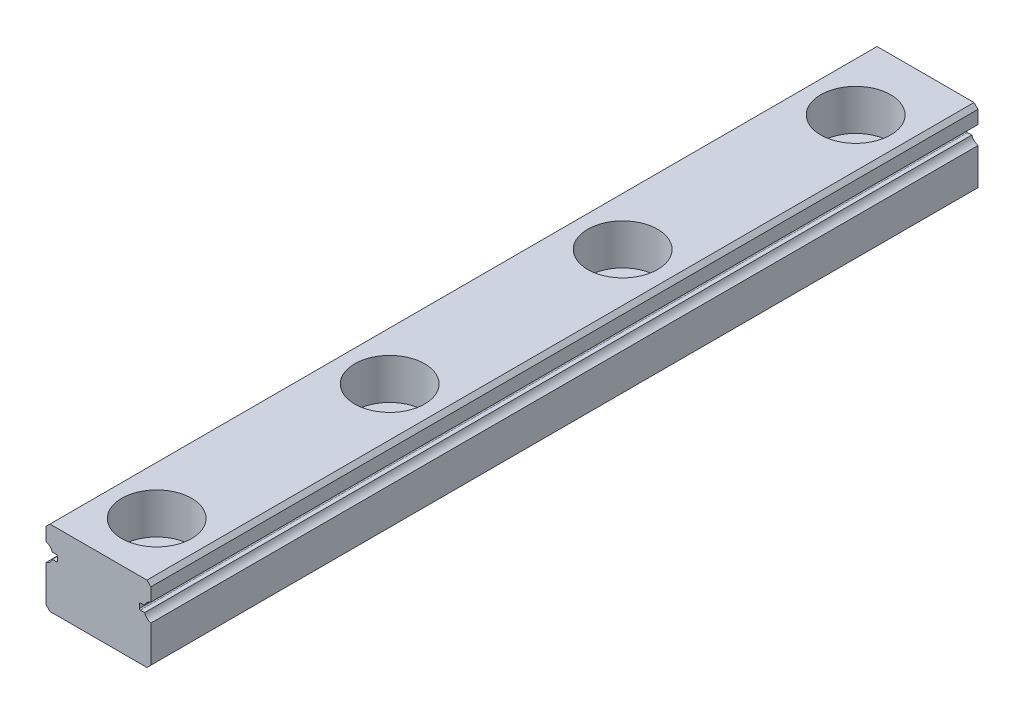
ISO-10303-21;
HEADER;
FILE_DESCRIPTION(('STEP AP214'),'2;1');
FILE_NAME('part.step','',(''),(''),'','','');
FILE_SCHEMA(('AUTOMOTIVE_DESIGN { 1 0 10303 214 1 1 1 1 }'));
ENDSEC;
DATA;
#1=APPLICATION_CONTEXT('core data for automotive mechanical design processes');
#2=APPLICATION_PROTOCOL_DEFINITION('international standard','automotive_design',2000,#1);
#3=PRODUCT_CONTEXT('',#1,'mechanical');
#4=PRODUCT('Part','Part','',(#3));
#5=PRODUCT_RELATED_PRODUCT_CATEGORY('part','',(#4));
#6=PRODUCT_DEFINITION_FORMATION('','',#4);
#7=PRODUCT_DEFINITION_CONTEXT('part definition',#1,'design');
#8=PRODUCT_DEFINITION('design','',#6,#7);
#9=PRODUCT_DEFINITION_SHAPE('','',#8);
#10=(LENGTH_UNIT() NAMED_UNIT(*) SI_UNIT(.MILLI.,.METRE.));
#11=(NAMED_UNIT(*) PLANE_ANGLE_UNIT() SI_UNIT($,.RADIAN.));
#12=(NAMED_UNIT(*) SI_UNIT($,.STERADIAN.) SOLID_ANGLE_UNIT());
#13=UNCERTAINTY_MEASURE_WITH_UNIT(LENGTH_MEASURE(1.E-05),#10,'distance_accuracy_value','');
#14=(GEOMETRIC_REPRESENTATION_CONTEXT(3) GLOBAL_UNCERTAINTY_ASSIGNED_CONTEXT((#13)) GLOBAL_UNIT_ASSIGNED_CONTEXT((#10,
#11,#12)) REPRESENTATION_CONTEXT('',''));
#15=CARTESIAN_POINT('',(0.,0.,0.));
#16=DIRECTION('',(0.,0.,1.));
#17=DIRECTION('',(1.,0.,0.));
#18=AXIS2_PLACEMENT_3D('',#15,#16,#17);
#19=CARTESIAN_POINT('',(4.5,4.1625,50.));
#20=DIRECTION('',(-0.707106781186546,-0.707106781186549,0.));
#21=DIRECTION('',(0.707106781186549,-0.707106781186546,0.));
#22=AXIS2_PLACEMENT_3D('',#19,#20,#21);
#23=PLANE('',#22);
#24=DIRECTION('',(0.707106781186549,-0.707106781186546,0.));
#25=VECTOR('',#24,1.);
#26=CARTESIAN_POINT('',(4.1625,4.5,-26.));
#27=LINE('',#26,#25);
#28=CARTESIAN_POINT('',(4.1625,4.5,-26.));
#29=VERTEX_POINT('',#28);
#30=CARTESIAN_POINT('',(4.5,4.1625,-26.));
#31=VERTEX_POINT('',#30);
#32=EDGE_CURVE('E65',#29,#31,#27,.T.);
#33=ORIENTED_EDGE('',*,*,#32,.F.);
#34=DIRECTION('',(0.,0.,-1.));
#35=VECTOR('',#34,1.);
#36=CARTESIAN_POINT('',(4.1625,4.5,50.));
#37=LINE('',#36,#35);
#38=CARTESIAN_POINT('',(4.1625,4.5,45.));
#39=VERTEX_POINT('',#38);
#40=EDGE_CURVE('E11',#39,#29,#37,.T.);
#41=ORIENTED_EDGE('',*,*,#40,.F.);
#42=DIRECTION('',(-0.707106781186549,0.707106781186546,0.));
#43=VECTOR('',#42,1.);
#44=CARTESIAN_POINT('',(4.5,4.1625,45.));
#45=LINE('',#44,#43);
#46=CARTESIAN_POINT('',(4.5,4.1625,45.));
#47=VERTEX_POINT('',#46);
#48=EDGE_CURVE('E233',#47,#39,#45,.T.);
#49=ORIENTED_EDGE('',*,*,#48,.F.);
#50=DIRECTION('',(0.,0.,-1.));
#51=VECTOR('',#50,1.);
#52=CARTESIAN_POINT('',(4.5,4.1625,50.));
#53=LINE('',#52,#51);
#54=EDGE_CURVE('E223',#47,#31,#53,.T.);
#55=ORIENTED_EDGE('',*,*,#54,.T.);
#56=EDGE_LOOP('',(#33,#41,#49,#55));
#57=FACE_BOUND('',#56,.T.);
#58=ADVANCED_FACE('F50',(#57),#23,.F.);
#59=CARTESIAN_POINT('',(4.1625,4.5,50.));
#60=DIRECTION('',(0.,-1.,0.));
#61=DIRECTION('',(0.,0.,-1.));
#62=AXIS2_PLACEMENT_3D('',#59,#60,#61);
#63=PLANE('',#62);
#64=CARTESIAN_POINT('',(0.,4.5,-20.));
#65=DIRECTION('',(0.,1.,0.));
#66=DIRECTION('',(0.,0.,1.));
#67=AXIS2_PLACEMENT_3D('',#64,#65,#66);
#68=CIRCLE('',#67,3.);
#69=CARTESIAN_POINT('',(0.,4.5,-17.));
#70=VERTEX_POINT('',#69);
#71=EDGE_CURVE('E301',#70,#70,#68,.T.);
#72=ORIENTED_EDGE('',*,*,#71,.F.);
#73=EDGE_LOOP('',(#72));
#74=FACE_BOUND('',#73,.T.);
#75=CARTESIAN_POINT('',(0.,4.5,0.));
#76=DIRECTION('',(0.,1.,0.));
#77=DIRECTION('',(0.,0.,1.));
#78=AXIS2_PLACEMENT_3D('',#75,#76,#77);
#79=CIRCLE('',#78,3.);
#80=CARTESIAN_POINT('',(0.,4.5,3.));
#81=VERTEX_POINT('',#80);
#82=EDGE_CURVE('E317',#81,#81,#79,.T.);
#83=ORIENTED_EDGE('',*,*,#82,.F.);
#84=EDGE_LOOP('',(#83));
#85=FACE_BOUND('',#84,.T.);
#86=CARTESIAN_POINT('',(0.,4.5,20.));
#87=DIRECTION('',(0.,1.,0.));
#88=DIRECTION('',(0.,0.,1.));
#89=AXIS2_PLACEMENT_3D('',#86,#87,#88);
#90=CIRCLE('',#89,3.);
#91=CARTESIAN_POINT('',(0.,4.5,23.));
#92=VERTEX_POINT('',#91);
#93=EDGE_CURVE('E333',#92,#92,#90,.T.);
#94=ORIENTED_EDGE('',*,*,#93,.F.);
#95=EDGE_LOOP('',(#94));
#96=FACE_BOUND('',#95,.T.);
#97=CARTESIAN_POINT('',(0.,4.5,40.));
#98=DIRECTION('',(0.,1.,0.));
#99=DIRECTION('',(0.,0.,1.));
#100=AXIS2_PLACEMENT_3D('',#97,#98,#99);
#101=CIRCLE('',#100,3.);
#102=CARTESIAN_POINT('',(0.,4.5,43.));
#103=VERTEX_POINT('',#102);
#104=EDGE_CURVE('E349',#103,#103,#101,.T.);
#105=ORIENTED_EDGE('',*,*,#104,.F.);
#106=EDGE_LOOP('',(#105));
#107=FACE_BOUND('',#106,.T.);
#108=DIRECTION('',(1.,0.,0.));
#109=VECTOR('',#108,1.);
#110=CARTESIAN_POINT('',(-4.1625,4.5,-26.));
#111=LINE('',#110,#109);
#112=CARTESIAN_POINT('',(-4.1625,4.5,-26.));
#113=VERTEX_POINT('',#112);
#114=EDGE_CURVE('E209',#113,#29,#111,.T.);
#115=ORIENTED_EDGE('',*,*,#114,.F.);
#116=DIRECTION('',(0.,0.,-1.));
#117=VECTOR('',#116,1.);
#118=CARTESIAN_POINT('',(-4.1625,4.5,50.));
#119=LINE('',#118,#117);
#120=CARTESIAN_POINT('',(-4.1625,4.5,45.));
#121=VERTEX_POINT('',#120);
#122=EDGE_CURVE('E58',#121,#113,#119,.T.);
#123=ORIENTED_EDGE('',*,*,#122,.F.);
#124=DIRECTION('',(-1.,0.,0.));
#125=VECTOR('',#124,1.);
#126=CARTESIAN_POINT('',(4.1625,4.5,45.));
#127=LINE('',#126,#125);
#128=EDGE_CURVE('E229',#39,#121,#127,.T.);
#129=ORIENTED_EDGE('',*,*,#128,.F.);
#130=ORIENTED_EDGE('',*,*,#40,.T.);
#131=EDGE_LOOP('',(#115,#123,#129,#130));
#132=FACE_BOUND('',#131,.T.);
#133=ADVANCED_FACE('F228',(#74,#85,#96,#107,#132),#63,.F.);
#134=CARTESIAN_POINT('',(-4.5,4.1625,50.));
#135=DIRECTION('',(0.707106781186546,-0.707106781186549,0.));
#136=DIRECTION('',(0.707106781186549,0.707106781186546,0.));
#137=AXIS2_PLACEMENT_3D('',#134,#135,#136);
#138=PLANE('',#137);
#139=DIRECTION('',(0.707106781186549,0.707106781186546,0.));
#140=VECTOR('',#139,1.);
#141=CARTESIAN_POINT('',(-4.5,4.1625,-26.));
#142=LINE('',#141,#140);
#143=CARTESIAN_POINT('',(-4.5,4.1625,-26.));
#144=VERTEX_POINT('',#143);
#145=EDGE_CURVE('E212',#144,#113,#142,.T.);
#146=ORIENTED_EDGE('',*,*,#145,.F.);
#147=DIRECTION('',(0.,0.,-1.));
#148=VECTOR('',#147,1.);
#149=CARTESIAN_POINT('',(-4.5,4.1625,50.));
#150=LINE('',#149,#148);
#151=CARTESIAN_POINT('',(-4.5,4.1625,45.));
#152=VERTEX_POINT('',#151);
#153=EDGE_CURVE('E447',#152,#144,#150,.T.);
#154=ORIENTED_EDGE('',*,*,#153,.F.);
#155=DIRECTION('',(-0.707106781186549,-0.707106781186546,0.));
#156=VECTOR('',#155,1.);
#157=CARTESIAN_POINT('',(-4.1625,4.5,45.));
#158=LINE('',#157,#156);
#159=EDGE_CURVE('E232',#121,#152,#158,.T.);
#160=ORIENTED_EDGE('',*,*,#159,.F.);
#161=ORIENTED_EDGE('',*,*,#122,.T.);
#162=EDGE_LOOP('',(#146,#154,#160,#161));
#163=FACE_BOUND('',#162,.T.);
#164=ADVANCED_FACE('F452',(#163),#138,.F.);
#165=CARTESIAN_POINT('',(-4.5,3.02625,50.));
#166=DIRECTION('',(1.,0.,0.));
#167=DIRECTION('',(0.,0.,-1.));
#168=AXIS2_PLACEMENT_3D('',#165,#166,#167);
#169=PLANE('',#168);
#170=DIRECTION('',(0.,1.,0.));
#171=VECTOR('',#170,1.);
#172=CARTESIAN_POINT('',(-4.5,3.02625,-26.));
#173=LINE('',#172,#171);
#174=CARTESIAN_POINT('',(-4.5,3.02625,-26.));
#175=VERTEX_POINT('',#174);
#176=EDGE_CURVE('E461',#175,#144,#173,.T.);
#177=ORIENTED_EDGE('',*,*,#176,.F.);
#178=DIRECTION('',(0.,0.,-1.));
#179=VECTOR('',#178,1.);
#180=CARTESIAN_POINT('',(-4.5,3.02625,50.));
#181=LINE('',#180,#179);
#182=CARTESIAN_POINT('',(-4.5,3.02625,45.));
#183=VERTEX_POINT('',#182);
#184=EDGE_CURVE('E443',#183,#175,#181,.T.);
#185=ORIENTED_EDGE('',*,*,#184,.F.);
#186=DIRECTION('',(0.,-1.,0.));
#187=VECTOR('',#186,1.);
#188=CARTESIAN_POINT('',(-4.5,4.1625,45.));
#189=LINE('',#188,#187);
#190=EDGE_CURVE('E237',#152,#183,#189,.T.);
#191=ORIENTED_EDGE('',*,*,#190,.F.);
#192=ORIENTED_EDGE('',*,*,#153,.T.);
#193=EDGE_LOOP('',(#177,#185,#191,#192));
#194=FACE_BOUND('',#193,.T.);
#195=ADVANCED_FACE('F460',(#194),#169,.F.);
#196=CARTESIAN_POINT('',(-4.725,2.25,50.));
#197=DIRECTION('',(0.,0.,-1.));
#198=DIRECTION('',(-1.,0.,0.));
#199=AXIS2_PLACEMENT_3D('',#196,#197,#198);
#200=CYLINDRICAL_SURFACE('',#199,0.808201127504782);
#201=CARTESIAN_POINT('',(-4.725,2.25,-26.));
#202=DIRECTION('',(0.,0.,1.));
#203=DIRECTION('',(-1.,0.,0.));
#204=AXIS2_PLACEMENT_3D('',#201,#202,#203);
#205=CIRCLE('',#204,0.808201127504782);
#206=CARTESIAN_POINT('',(-3.96323293422464,2.52,-26.));
#207=VERTEX_POINT('',#206);
#208=EDGE_CURVE('E466',#207,#175,#205,.T.);
#209=ORIENTED_EDGE('',*,*,#208,.F.);
#210=DIRECTION('',(0.,0.,-1.));
#211=VECTOR('',#210,1.);
#212=CARTESIAN_POINT('',(-3.96323293422464,2.52,50.));
#213=LINE('',#212,#211);
#214=CARTESIAN_POINT('',(-3.96323293422464,2.52,45.));
#215=VERTEX_POINT('',#214);
#216=EDGE_CURVE('E439',#215,#207,#213,.T.);
#217=ORIENTED_EDGE('',*,*,#216,.F.);
#218=CARTESIAN_POINT('',(-4.725,2.25,45.));
#219=DIRECTION('',(0.,0.,-1.));
#220=DIRECTION('',(1.,0.,0.));
#221=AXIS2_PLACEMENT_3D('',#218,#219,#220);
#222=CIRCLE('',#221,0.808201127504782);
#223=EDGE_CURVE('E245',#183,#215,#222,.T.);
#224=ORIENTED_EDGE('',*,*,#223,.F.);
#225=ORIENTED_EDGE('',*,*,#184,.T.);
#226=EDGE_LOOP('',(#209,#217,#224,#225));
#227=FACE_BOUND('',#226,.T.);
#228=ADVANCED_FACE('F464',(#227),#200,.F.);
#229=CARTESIAN_POINT('',(-3.96323293422464,2.52,50.));
#230=DIRECTION('',(0.,1.,0.));
#231=DIRECTION('',(0.,0.,1.));
#232=AXIS2_PLACEMENT_3D('',#229,#230,#231);
#233=PLANE('',#232);
#234=DIRECTION('',(-1.,0.,0.));
#235=VECTOR('',#234,1.);
#236=CARTESIAN_POINT('',(-3.60323293422464,2.52,-26.));
#237=LINE('',#236,#235);
#238=CARTESIAN_POINT('',(-3.60323293422464,2.52,-26.));
#239=VERTEX_POINT('',#238);
#240=EDGE_CURVE('E473',#239,#207,#237,.T.);
#241=ORIENTED_EDGE('',*,*,#240,.F.);
#242=DIRECTION('',(0.,0.,-1.));
#243=VECTOR('',#242,1.);
#244=CARTESIAN_POINT('',(-3.60323293422464,2.52,50.));
#245=LINE('',#244,#243);
#246=CARTESIAN_POINT('',(-3.60323293422464,2.52,45.));
#247=VERTEX_POINT('',#246);
#248=EDGE_CURVE('E435',#247,#239,#245,.T.);
#249=ORIENTED_EDGE('',*,*,#248,.F.);
#250=DIRECTION('',(1.,0.,0.));
#251=VECTOR('',#250,1.);
#252=CARTESIAN_POINT('',(-3.96323293422464,2.52,45.));
#253=LINE('',#252,#251);
#254=EDGE_CURVE('E248',#215,#247,#253,.T.);
#255=ORIENTED_EDGE('',*,*,#254,.F.);
#256=ORIENTED_EDGE('',*,*,#216,.T.);
#257=EDGE_LOOP('',(#241,#249,#255,#256));
#258=FACE_BOUND('',#257,.T.);
#259=ADVANCED_FACE('F472',(#258),#233,.F.);
#260=CARTESIAN_POINT('',(-3.60323293422464,2.43,50.));
#261=DIRECTION('',(0.,0.,-1.));
#262=DIRECTION('',(-1.,0.,0.));
#263=AXIS2_PLACEMENT_3D('',#260,#261,#262);
#264=CYLINDRICAL_SURFACE('',#263,0.0900000000000002);
#265=CARTESIAN_POINT('',(-3.60323293422464,2.43,-26.));
#266=DIRECTION('',(0.,0.,1.));
#267=DIRECTION('',(-1.,0.,0.));
#268=AXIS2_PLACEMENT_3D('',#265,#266,#267);
#269=CIRCLE('',#268,0.0900000000000002);
#270=CARTESIAN_POINT('',(-3.51323293422464,2.43,-26.));
#271=VERTEX_POINT('',#270);
#272=EDGE_CURVE('E478',#271,#239,#269,.T.);
#273=ORIENTED_EDGE('',*,*,#272,.F.);
#274=DIRECTION('',(0.,0.,-1.));
#275=VECTOR('',#274,1.);
#276=CARTESIAN_POINT('',(-3.51323293422464,2.43,50.));
#277=LINE('',#276,#275);
#278=CARTESIAN_POINT('',(-3.51323293422464,2.43,45.));
#279=VERTEX_POINT('',#278);
#280=EDGE_CURVE('E431',#279,#271,#277,.T.);
#281=ORIENTED_EDGE('',*,*,#280,.F.);
#282=CARTESIAN_POINT('',(-3.60323293422464,2.43,45.));
#283=DIRECTION('',(0.,0.,-1.));
#284=DIRECTION('',(1.,0.,0.));
#285=AXIS2_PLACEMENT_3D('',#282,#283,#284);
#286=CIRCLE('',#285,0.0900000000000002);
#287=EDGE_CURVE('E251',#247,#279,#286,.T.);
#288=ORIENTED_EDGE('',*,*,#287,.F.);
#289=ORIENTED_EDGE('',*,*,#248,.T.);
#290=EDGE_LOOP('',(#273,#281,#288,#289));
#291=FACE_BOUND('',#290,.T.);
#292=ADVANCED_FACE('F476',(#291),#264,.F.);
#293=CARTESIAN_POINT('',(-3.51323293422464,2.43,50.));
#294=DIRECTION('',(1.,0.,0.));
#295=DIRECTION('',(0.,0.,-1.));
#296=AXIS2_PLACEMENT_3D('',#293,#294,#295);
#297=PLANE('',#296);
#298=DIRECTION('',(0.,1.,0.));
#299=VECTOR('',#298,1.);
#300=CARTESIAN_POINT('',(-3.51323293422464,2.07,-26.));
#301=LINE('',#300,#299);
#302=CARTESIAN_POINT('',(-3.51323293422464,2.07,-26.));
#303=VERTEX_POINT('',#302);
#304=EDGE_CURVE('E485',#303,#271,#301,.T.);
#305=ORIENTED_EDGE('',*,*,#304,.F.);
#306=DIRECTION('',(0.,0.,-1.));
#307=VECTOR('',#306,1.);
#308=CARTESIAN_POINT('',(-3.51323293422464,2.07,50.));
#309=LINE('',#308,#307);
#310=CARTESIAN_POINT('',(-3.51323293422464,2.07,45.));
#311=VERTEX_POINT('',#310);
#312=EDGE_CURVE('E427',#311,#303,#309,.T.);
#313=ORIENTED_EDGE('',*,*,#312,.F.);
#314=DIRECTION('',(0.,-1.,0.));
#315=VECTOR('',#314,1.);
#316=CARTESIAN_POINT('',(-3.51323293422464,2.43,45.));
#317=LINE('',#316,#315);
#318=EDGE_CURVE('E254',#279,#311,#317,.T.);
#319=ORIENTED_EDGE('',*,*,#318,.F.);
#320=ORIENTED_EDGE('',*,*,#280,.T.);
#321=EDGE_LOOP('',(#305,#313,#319,#320));
#322=FACE_BOUND('',#321,.T.);
#323=ADVANCED_FACE('F484',(#322),#297,.F.);
#324=CARTESIAN_POINT('',(-3.60323293422464,2.07,50.));
#325=DIRECTION('',(0.,0.,-1.));
#326=DIRECTION('',(-1.,0.,0.));
#327=AXIS2_PLACEMENT_3D('',#324,#325,#326);
#328=CYLINDRICAL_SURFACE('',#327,0.0900000000000002);
#329=CARTESIAN_POINT('',(-3.60323293422464,2.07,-26.));
#330=DIRECTION('',(0.,0.,1.));
#331=DIRECTION('',(-1.,0.,0.));
#332=AXIS2_PLACEMENT_3D('',#329,#330,#331);
#333=CIRCLE('',#332,0.0900000000000002);
#334=CARTESIAN_POINT('',(-3.60323293422464,1.98,-26.));
#335=VERTEX_POINT('',#334);
#336=EDGE_CURVE('E490',#335,#303,#333,.T.);
#337=ORIENTED_EDGE('',*,*,#336,.F.);
#338=DIRECTION('',(0.,0.,-1.));
#339=VECTOR('',#338,1.);
#340=CARTESIAN_POINT('',(-3.60323293422464,1.98,50.));
#341=LINE('',#340,#339);
#342=CARTESIAN_POINT('',(-3.60323293422464,1.98,45.));
#343=VERTEX_POINT('',#342);
#344=EDGE_CURVE('E423',#343,#335,#341,.T.);
#345=ORIENTED_EDGE('',*,*,#344,.F.);
#346=CARTESIAN_POINT('',(-3.60323293422464,2.07,45.));
#347=DIRECTION('',(0.,0.,-1.));
#348=DIRECTION('',(1.,0.,0.));
#349=AXIS2_PLACEMENT_3D('',#346,#347,#348);
#350=CIRCLE('',#349,0.0900000000000002);
#351=EDGE_CURVE('E257',#311,#343,#350,.T.);
#352=ORIENTED_EDGE('',*,*,#351,.F.);
#353=ORIENTED_EDGE('',*,*,#312,.T.);
#354=EDGE_LOOP('',(#337,#345,#352,#353));
#355=FACE_BOUND('',#354,.T.);
#356=ADVANCED_FACE('F488',(#355),#328,.F.);
#357=CARTESIAN_POINT('',(-3.96323293422464,1.98,50.));
#358=DIRECTION('',(0.,-1.,0.));
#359=DIRECTION('',(1.,0.,0.));
#360=AXIS2_PLACEMENT_3D('',#357,#358,#359);
#361=PLANE('',#360);
#362=DIRECTION('',(1.,0.,0.));
#363=VECTOR('',#362,1.);
#364=CARTESIAN_POINT('',(-3.96323293422464,1.98,-26.));
#365=LINE('',#364,#363);
#366=CARTESIAN_POINT('',(-3.96323293422464,1.98,-26.));
#367=VERTEX_POINT('',#366);
#368=EDGE_CURVE('E497',#367,#335,#365,.T.);
#369=ORIENTED_EDGE('',*,*,#368,.F.);
#370=DIRECTION('',(0.,0.,-1.));
#371=VECTOR('',#370,1.);
#372=CARTESIAN_POINT('',(-3.96323293422464,1.98,50.));
#373=LINE('',#372,#371);
#374=CARTESIAN_POINT('',(-3.96323293422464,1.98,45.));
#375=VERTEX_POINT('',#374);
#376=EDGE_CURVE('E419',#375,#367,#373,.T.);
#377=ORIENTED_EDGE('',*,*,#376,.F.);
#378=DIRECTION('',(-1.,0.,0.));
#379=VECTOR('',#378,1.);
#380=CARTESIAN_POINT('',(-3.60323293422464,1.98,45.));
#381=LINE('',#380,#379);
#382=EDGE_CURVE('E260',#343,#375,#381,.T.);
#383=ORIENTED_EDGE('',*,*,#382,.F.);
#384=ORIENTED_EDGE('',*,*,#344,.T.);
#385=EDGE_LOOP('',(#369,#377,#383,#384));
#386=FACE_BOUND('',#385,.T.);
#387=ADVANCED_FACE('F496',(#386),#361,.F.);
#388=CARTESIAN_POINT('',(-4.725,2.25,50.));
#389=DIRECTION('',(0.,0.,-1.));
#390=DIRECTION('',(-1.,0.,0.));
#391=AXIS2_PLACEMENT_3D('',#388,#389,#390);
#392=CYLINDRICAL_SURFACE('',#391,0.808201127504782);
#393=CARTESIAN_POINT('',(-4.725,2.25,-26.));
#394=DIRECTION('',(0.,0.,1.));
#395=DIRECTION('',(-1.,0.,0.));
#396=AXIS2_PLACEMENT_3D('',#393,#394,#395);
#397=CIRCLE('',#396,0.808201127504782);
#398=CARTESIAN_POINT('',(-4.5,1.47375,-26.));
#399=VERTEX_POINT('',#398);
#400=EDGE_CURVE('E502',#399,#367,#397,.T.);
#401=ORIENTED_EDGE('',*,*,#400,.F.);
#402=DIRECTION('',(0.,0.,-1.));
#403=VECTOR('',#402,1.);
#404=CARTESIAN_POINT('',(-4.5,1.47375,50.));
#405=LINE('',#404,#403);
#406=CARTESIAN_POINT('',(-4.5,1.47375,45.));
#407=VERTEX_POINT('',#406);
#408=EDGE_CURVE('E415',#407,#399,#405,.T.);
#409=ORIENTED_EDGE('',*,*,#408,.F.);
#410=CARTESIAN_POINT('',(-4.725,2.25,45.));
#411=DIRECTION('',(0.,0.,-1.));
#412=DIRECTION('',(1.,0.,0.));
#413=AXIS2_PLACEMENT_3D('',#410,#411,#412);
#414=CIRCLE('',#413,0.808201127504782);
#415=EDGE_CURVE('E263',#375,#407,#414,.T.);
#416=ORIENTED_EDGE('',*,*,#415,.F.);
#417=ORIENTED_EDGE('',*,*,#376,.T.);
#418=EDGE_LOOP('',(#401,#409,#416,#417));
#419=FACE_BOUND('',#418,.T.);
#420=ADVANCED_FACE('F500',(#419),#392,.F.);
#421=CARTESIAN_POINT('',(-4.5,-1.6625,50.));
#422=DIRECTION('',(1.,0.,0.));
#423=DIRECTION('',(0.,0.,-1.));
#424=AXIS2_PLACEMENT_3D('',#421,#422,#423);
#425=PLANE('',#424);
#426=DIRECTION('',(0.,1.,0.));
#427=VECTOR('',#426,1.);
#428=CARTESIAN_POINT('',(-4.5,-1.6625,-26.));
#429=LINE('',#428,#427);
#430=CARTESIAN_POINT('',(-4.5,-1.6625,-26.));
#431=VERTEX_POINT('',#430);
#432=EDGE_CURVE('E509',#431,#399,#429,.T.);
#433=ORIENTED_EDGE('',*,*,#432,.F.);
#434=DIRECTION('',(0.,0.,-1.));
#435=VECTOR('',#434,1.);
#436=CARTESIAN_POINT('',(-4.5,-1.6625,50.));
#437=LINE('',#436,#435);
#438=CARTESIAN_POINT('',(-4.5,-1.6625,45.));
#439=VERTEX_POINT('',#438);
#440=EDGE_CURVE('E411',#439,#431,#437,.T.);
#441=ORIENTED_EDGE('',*,*,#440,.F.);
#442=DIRECTION('',(0.,-1.,0.));
#443=VECTOR('',#442,1.);
#444=CARTESIAN_POINT('',(-4.5,1.47375,45.));
#445=LINE('',#444,#443);
#446=EDGE_CURVE('E266',#407,#439,#445,.T.);
#447=ORIENTED_EDGE('',*,*,#446,.F.);
#448=ORIENTED_EDGE('',*,*,#408,.T.);
#449=EDGE_LOOP('',(#433,#441,#447,#448));
#450=FACE_BOUND('',#449,.T.);
#451=ADVANCED_FACE('F508',(#450),#425,.F.);
#452=CARTESIAN_POINT('',(-4.1625,-2.,50.));
#453=DIRECTION('',(0.707106781186549,0.707106781186546,0.));
#454=DIRECTION('',(-0.707106781186546,0.707106781186549,0.));
#455=AXIS2_PLACEMENT_3D('',#452,#453,#454);
#456=PLANE('',#455);
#457=DIRECTION('',(-0.707106781186546,0.707106781186549,0.));
#458=VECTOR('',#457,1.);
#459=CARTESIAN_POINT('',(-4.1625,-2.,-26.));
#460=LINE('',#459,#458);
#461=CARTESIAN_POINT('',(-4.1625,-2.,-26.));
#462=VERTEX_POINT('',#461);
#463=EDGE_CURVE('E514',#462,#431,#460,.T.);
#464=ORIENTED_EDGE('',*,*,#463,.F.);
#465=DIRECTION('',(0.,0.,-1.));
#466=VECTOR('',#465,1.);
#467=CARTESIAN_POINT('',(-4.1625,-2.,50.));
#468=LINE('',#467,#466);
#469=CARTESIAN_POINT('',(-4.1625,-2.,45.));
#470=VERTEX_POINT('',#469);
#471=EDGE_CURVE('E407',#470,#462,#468,.T.);
#472=ORIENTED_EDGE('',*,*,#471,.F.);
#473=DIRECTION('',(0.707106781186546,-0.707106781186549,0.));
#474=VECTOR('',#473,1.);
#475=CARTESIAN_POINT('',(-4.5,-1.6625,45.));
#476=LINE('',#475,#474);
#477=EDGE_CURVE('E269',#439,#470,#476,.T.);
#478=ORIENTED_EDGE('',*,*,#477,.F.);
#479=ORIENTED_EDGE('',*,*,#440,.T.);
#480=EDGE_LOOP('',(#464,#472,#478,#479));
#481=FACE_BOUND('',#480,.T.);
#482=ADVANCED_FACE('F512',(#481),#456,.F.);
#483=CARTESIAN_POINT('',(-4.1625,-2.,50.));
#484=DIRECTION('',(0.,1.,0.));
#485=DIRECTION('',(0.,0.,1.));
#486=AXIS2_PLACEMENT_3D('',#483,#484,#485);
#487=PLANE('',#486);
#488=CARTESIAN_POINT('',(0.,-2.,-20.));
#489=DIRECTION('',(0.,1.,0.));
#490=DIRECTION('',(0.,0.,1.));
#491=AXIS2_PLACEMENT_3D('',#488,#489,#490);
#492=CIRCLE('',#491,1.75);
#493=CARTESIAN_POINT('',(0.,-2.,-18.25));
#494=VERTEX_POINT('',#493);
#495=EDGE_CURVE('E313',#494,#494,#492,.T.);
#496=ORIENTED_EDGE('',*,*,#495,.T.);
#497=EDGE_LOOP('',(#496));
#498=FACE_BOUND('',#497,.T.);
#499=CARTESIAN_POINT('',(0.,-2.,0.));
#500=DIRECTION('',(0.,1.,0.));
#501=DIRECTION('',(0.,0.,1.));
#502=AXIS2_PLACEMENT_3D('',#499,#500,#501);
#503=CIRCLE('',#502,1.75);
#504=CARTESIAN_POINT('',(0.,-2.,1.75));
#505=VERTEX_POINT('',#504);
#506=EDGE_CURVE('E329',#505,#505,#503,.T.);
#507=ORIENTED_EDGE('',*,*,#506,.T.);
#508=EDGE_LOOP('',(#507));
#509=FACE_BOUND('',#508,.T.);
#510=CARTESIAN_POINT('',(0.,-2.,20.));
#511=DIRECTION('',(0.,1.,0.));
#512=DIRECTION('',(0.,0.,1.));
#513=AXIS2_PLACEMENT_3D('',#510,#511,#512);
#514=CIRCLE('',#513,1.75);
#515=CARTESIAN_POINT('',(0.,-2.,21.75));
#516=VERTEX_POINT('',#515);
#517=EDGE_CURVE('E345',#516,#516,#514,.T.);
#518=ORIENTED_EDGE('',*,*,#517,.T.);
#519=EDGE_LOOP('',(#518));
#520=FACE_BOUND('',#519,.T.);
#521=CARTESIAN_POINT('',(0.,-2.,40.));
#522=DIRECTION('',(0.,1.,0.));
#523=DIRECTION('',(0.,0.,1.));
#524=AXIS2_PLACEMENT_3D('',#521,#522,#523);
#525=CIRCLE('',#524,1.75);
#526=CARTESIAN_POINT('',(0.,-2.,41.75));
#527=VERTEX_POINT('',#526);
#528=EDGE_CURVE('E361',#527,#527,#525,.T.);
#529=ORIENTED_EDGE('',*,*,#528,.T.);
#530=EDGE_LOOP('',(#529));
#531=FACE_BOUND('',#530,.T.);
#532=DIRECTION('',(-1.,0.,0.));
#533=VECTOR('',#532,1.);
#534=CARTESIAN_POINT('',(4.1625,-2.,-26.));
#535=LINE('',#534,#533);
#536=CARTESIAN_POINT('',(4.1625,-2.,-26.));
#537=VERTEX_POINT('',#536);
#538=EDGE_CURVE('E521',#537,#462,#535,.T.);
#539=ORIENTED_EDGE('',*,*,#538,.F.);
#540=DIRECTION('',(0.,0.,-1.));
#541=VECTOR('',#540,1.);
#542=CARTESIAN_POINT('',(4.1625,-2.,50.));
#543=LINE('',#542,#541);
#544=CARTESIAN_POINT('',(4.1625,-2.,45.));
#545=VERTEX_POINT('',#544);
#546=EDGE_CURVE('E403',#545,#537,#543,.T.);
#547=ORIENTED_EDGE('',*,*,#546,.F.);
#548=DIRECTION('',(1.,0.,0.));
#549=VECTOR('',#548,1.);
#550=CARTESIAN_POINT('',(-4.1625,-2.,45.));
#551=LINE('',#550,#549);
#552=EDGE_CURVE('E272',#470,#545,#551,.T.);
#553=ORIENTED_EDGE('',*,*,#552,.F.);
#554=ORIENTED_EDGE('',*,*,#471,.T.);
#555=EDGE_LOOP('',(#539,#547,#553,#554));
#556=FACE_BOUND('',#555,.T.);
#557=ADVANCED_FACE('F520',(#498,#509,#520,#531,#556),#487,.F.);
#558=CARTESIAN_POINT('',(4.1625,-2.,50.));
#559=DIRECTION('',(-0.707106781186549,0.707106781186546,0.));
#560=DIRECTION('',(-0.707106781186546,-0.707106781186549,0.));
#561=AXIS2_PLACEMENT_3D('',#558,#559,#560);
#562=PLANE('',#561);
#563=DIRECTION('',(-0.707106781186546,-0.707106781186549,0.));
#564=VECTOR('',#563,1.);
#565=CARTESIAN_POINT('',(4.5,-1.6625,-26.));
#566=LINE('',#565,#564);
#567=CARTESIAN_POINT('',(4.5,-1.6625,-26.));
#568=VERTEX_POINT('',#567);
#569=EDGE_CURVE('E526',#568,#537,#566,.T.);
#570=ORIENTED_EDGE('',*,*,#569,.F.);
#571=DIRECTION('',(0.,0.,-1.));
#572=VECTOR('',#571,1.);
#573=CARTESIAN_POINT('',(4.5,-1.6625,50.));
#574=LINE('',#573,#572);
#575=CARTESIAN_POINT('',(4.5,-1.6625,45.));
#576=VERTEX_POINT('',#575);
#577=EDGE_CURVE('E399',#576,#568,#574,.T.);
#578=ORIENTED_EDGE('',*,*,#577,.F.);
#579=DIRECTION('',(0.707106781186546,0.707106781186549,0.));
#580=VECTOR('',#579,1.);
#581=CARTESIAN_POINT('',(4.1625,-2.,45.));
#582=LINE('',#581,#580);
#583=EDGE_CURVE('E275',#545,#576,#582,.T.);
#584=ORIENTED_EDGE('',*,*,#583,.F.);
#585=ORIENTED_EDGE('',*,*,#546,.T.);
#586=EDGE_LOOP('',(#570,#578,#584,#585));
#587=FACE_BOUND('',#586,.T.);
#588=ADVANCED_FACE('F524',(#587),#562,.F.);
#589=CARTESIAN_POINT('',(4.5,-1.6625,50.));
#590=DIRECTION('',(-1.,0.,0.));
#591=DIRECTION('',(0.,0.,1.));
#592=AXIS2_PLACEMENT_3D('',#589,#590,#591);
#593=PLANE('',#592);
#594=DIRECTION('',(0.,-1.,0.));
#595=VECTOR('',#594,1.);
#596=CARTESIAN_POINT('',(4.5,1.47375,-26.));
#597=LINE('',#596,#595);
#598=CARTESIAN_POINT('',(4.5,1.47375,-26.));
#599=VERTEX_POINT('',#598);
#600=EDGE_CURVE('E533',#599,#568,#597,.T.);
#601=ORIENTED_EDGE('',*,*,#600,.F.);
#602=DIRECTION('',(0.,0.,-1.));
#603=VECTOR('',#602,1.);
#604=CARTESIAN_POINT('',(4.5,1.47375,50.));
#605=LINE('',#604,#603);
#606=CARTESIAN_POINT('',(4.5,1.47375,45.));
#607=VERTEX_POINT('',#606);
#608=EDGE_CURVE('E395',#607,#599,#605,.T.);
#609=ORIENTED_EDGE('',*,*,#608,.F.);
#610=DIRECTION('',(0.,1.,0.));
#611=VECTOR('',#610,1.);
#612=CARTESIAN_POINT('',(4.5,-1.6625,45.));
#613=LINE('',#612,#611);
#614=EDGE_CURVE('E278',#576,#607,#613,.T.);
#615=ORIENTED_EDGE('',*,*,#614,.F.);
#616=ORIENTED_EDGE('',*,*,#577,.T.);
#617=EDGE_LOOP('',(#601,#609,#615,#616));
#618=FACE_BOUND('',#617,.T.);
#619=ADVANCED_FACE('F532',(#618),#593,.F.);
#620=CARTESIAN_POINT('',(4.725,2.25,50.));
#621=DIRECTION('',(0.,0.,-1.));
#622=DIRECTION('',(-1.,0.,0.));
#623=AXIS2_PLACEMENT_3D('',#620,#621,#622);
#624=CYLINDRICAL_SURFACE('',#623,0.808201127504782);
#625=CARTESIAN_POINT('',(4.725,2.25,-26.));
#626=DIRECTION('',(0.,0.,1.));
#627=DIRECTION('',(-1.,0.,0.));
#628=AXIS2_PLACEMENT_3D('',#625,#626,#627);
#629=CIRCLE('',#628,0.808201127504781);
#630=CARTESIAN_POINT('',(3.96323293422464,1.98,-26.));
#631=VERTEX_POINT('',#630);
#632=EDGE_CURVE('E538',#631,#599,#629,.T.);
#633=ORIENTED_EDGE('',*,*,#632,.F.);
#634=DIRECTION('',(0.,0.,-1.));
#635=VECTOR('',#634,1.);
#636=CARTESIAN_POINT('',(3.96323293422464,1.98,50.));
#637=LINE('',#636,#635);
#638=CARTESIAN_POINT('',(3.96323293422464,1.98,45.));
#639=VERTEX_POINT('',#638);
#640=EDGE_CURVE('E391',#639,#631,#637,.T.);
#641=ORIENTED_EDGE('',*,*,#640,.F.);
#642=CARTESIAN_POINT('',(4.725,2.25,45.));
#643=DIRECTION('',(0.,0.,-1.));
#644=DIRECTION('',(1.,0.,0.));
#645=AXIS2_PLACEMENT_3D('',#642,#643,#644);
#646=CIRCLE('',#645,0.808201127504782);
#647=EDGE_CURVE('E281',#607,#639,#646,.T.);
#648=ORIENTED_EDGE('',*,*,#647,.F.);
#649=ORIENTED_EDGE('',*,*,#608,.T.);
#650=EDGE_LOOP('',(#633,#641,#648,#649));
#651=FACE_BOUND('',#650,.T.);
#652=ADVANCED_FACE('F536',(#651),#624,.F.);
#653=CARTESIAN_POINT('',(3.96323293422464,1.98,50.));
#654=DIRECTION('',(0.,-1.,0.));
#655=DIRECTION('',(0.,0.,-1.));
#656=AXIS2_PLACEMENT_3D('',#653,#654,#655);
#657=PLANE('',#656);
#658=DIRECTION('',(1.,0.,0.));
#659=VECTOR('',#658,1.);
#660=CARTESIAN_POINT('',(3.60323293422464,1.98,-26.));
#661=LINE('',#660,#659);
#662=CARTESIAN_POINT('',(3.60323293422464,1.98,-26.));
#663=VERTEX_POINT('',#662);
#664=EDGE_CURVE('E545',#663,#631,#661,.T.);
#665=ORIENTED_EDGE('',*,*,#664,.F.);
#666=DIRECTION('',(0.,0.,-1.));
#667=VECTOR('',#666,1.);
#668=CARTESIAN_POINT('',(3.60323293422464,1.98,50.));
#669=LINE('',#668,#667);
#670=CARTESIAN_POINT('',(3.60323293422464,1.98,45.));
#671=VERTEX_POINT('',#670);
#672=EDGE_CURVE('E387',#671,#663,#669,.T.);
#673=ORIENTED_EDGE('',*,*,#672,.F.);
#674=DIRECTION('',(-1.,0.,0.));
#675=VECTOR('',#674,1.);
#676=CARTESIAN_POINT('',(3.96323293422464,1.98,45.));
#677=LINE('',#676,#675);
#678=EDGE_CURVE('E284',#639,#671,#677,.T.);
#679=ORIENTED_EDGE('',*,*,#678,.F.);
#680=ORIENTED_EDGE('',*,*,#640,.T.);
#681=EDGE_LOOP('',(#665,#673,#679,#680));
#682=FACE_BOUND('',#681,.T.);
#683=ADVANCED_FACE('F544',(#682),#657,.F.);
#684=CARTESIAN_POINT('',(3.60323293422464,2.07,50.));
#685=DIRECTION('',(0.,0.,-1.));
#686=DIRECTION('',(-1.,0.,0.));
#687=AXIS2_PLACEMENT_3D('',#684,#685,#686);
#688=CYLINDRICAL_SURFACE('',#687,0.0899999999999998);
#689=CARTESIAN_POINT('',(3.60323293422464,2.07,-26.));
#690=DIRECTION('',(0.,0.,1.));
#691=DIRECTION('',(-1.,0.,0.));
#692=AXIS2_PLACEMENT_3D('',#689,#690,#691);
#693=CIRCLE('',#692,0.0899999999999998);
#694=CARTESIAN_POINT('',(3.51323293422464,2.07,-26.));
#695=VERTEX_POINT('',#694);
#696=EDGE_CURVE('E550',#695,#663,#693,.T.);
#697=ORIENTED_EDGE('',*,*,#696,.F.);
#698=DIRECTION('',(0.,0.,-1.));
#699=VECTOR('',#698,1.);
#700=CARTESIAN_POINT('',(3.51323293422464,2.07,50.));
#701=LINE('',#700,#699);
#702=CARTESIAN_POINT('',(3.51323293422464,2.07,45.));
#703=VERTEX_POINT('',#702);
#704=EDGE_CURVE('E383',#703,#695,#701,.T.);
#705=ORIENTED_EDGE('',*,*,#704,.F.);
#706=CARTESIAN_POINT('',(3.60323293422464,2.07,45.));
#707=DIRECTION('',(0.,0.,-1.));
#708=DIRECTION('',(1.,0.,0.));
#709=AXIS2_PLACEMENT_3D('',#706,#707,#708);
#710=CIRCLE('',#709,0.0899999999999998);
#711=EDGE_CURVE('E287',#671,#703,#710,.T.);
#712=ORIENTED_EDGE('',*,*,#711,.F.);
#713=ORIENTED_EDGE('',*,*,#672,.T.);
#714=EDGE_LOOP('',(#697,#705,#712,#713));
#715=FACE_BOUND('',#714,.T.);
#716=ADVANCED_FACE('F548',(#715),#688,.F.);
#717=CARTESIAN_POINT('',(3.51323293422464,2.43,50.));
#718=DIRECTION('',(-1.,0.,0.));
#719=DIRECTION('',(0.,-1.,0.));
#720=AXIS2_PLACEMENT_3D('',#717,#718,#719);
#721=PLANE('',#720);
#722=DIRECTION('',(0.,-1.,0.));
#723=VECTOR('',#722,1.);
#724=CARTESIAN_POINT('',(3.51323293422464,2.43,-26.));
#725=LINE('',#724,#723);
#726=CARTESIAN_POINT('',(3.51323293422464,2.43,-26.));
#727=VERTEX_POINT('',#726);
#728=EDGE_CURVE('E557',#727,#695,#725,.T.);
#729=ORIENTED_EDGE('',*,*,#728,.F.);
#730=DIRECTION('',(0.,0.,-1.));
#731=VECTOR('',#730,1.);
#732=CARTESIAN_POINT('',(3.51323293422464,2.43,50.));
#733=LINE('',#732,#731);
#734=CARTESIAN_POINT('',(3.51323293422464,2.43,45.));
#735=VERTEX_POINT('',#734);
#736=EDGE_CURVE('E379',#735,#727,#733,.T.);
#737=ORIENTED_EDGE('',*,*,#736,.F.);
#738=DIRECTION('',(0.,1.,0.));
#739=VECTOR('',#738,1.);
#740=CARTESIAN_POINT('',(3.51323293422464,2.07,45.));
#741=LINE('',#740,#739);
#742=EDGE_CURVE('E290',#703,#735,#741,.T.);
#743=ORIENTED_EDGE('',*,*,#742,.F.);
#744=ORIENTED_EDGE('',*,*,#704,.T.);
#745=EDGE_LOOP('',(#729,#737,#743,#744));
#746=FACE_BOUND('',#745,.T.);
#747=ADVANCED_FACE('F556',(#746),#721,.F.);
#748=CARTESIAN_POINT('',(3.60323293422464,2.43,50.));
#749=DIRECTION('',(0.,0.,-1.));
#750=DIRECTION('',(-1.,0.,0.));
#751=AXIS2_PLACEMENT_3D('',#748,#749,#750);
#752=CYLINDRICAL_SURFACE('',#751,0.0900000000000002);
#753=CARTESIAN_POINT('',(3.60323293422464,2.43,-26.));
#754=DIRECTION('',(0.,0.,1.));
#755=DIRECTION('',(-1.,0.,0.));
#756=AXIS2_PLACEMENT_3D('',#753,#754,#755);
#757=CIRCLE('',#756,0.0900000000000002);
#758=CARTESIAN_POINT('',(3.60323293422464,2.52,-26.));
#759=VERTEX_POINT('',#758);
#760=EDGE_CURVE('E562',#759,#727,#757,.T.);
#761=ORIENTED_EDGE('',*,*,#760,.F.);
#762=DIRECTION('',(0.,0.,-1.));
#763=VECTOR('',#762,1.);
#764=CARTESIAN_POINT('',(3.60323293422464,2.52,50.));
#765=LINE('',#764,#763);
#766=CARTESIAN_POINT('',(3.60323293422464,2.52,45.));
#767=VERTEX_POINT('',#766);
#768=EDGE_CURVE('E375',#767,#759,#765,.T.);
#769=ORIENTED_EDGE('',*,*,#768,.F.);
#770=CARTESIAN_POINT('',(3.60323293422464,2.43,45.));
#771=DIRECTION('',(0.,0.,-1.));
#772=DIRECTION('',(1.,0.,0.));
#773=AXIS2_PLACEMENT_3D('',#770,#771,#772);
#774=CIRCLE('',#773,0.0900000000000002);
#775=EDGE_CURVE('E293',#735,#767,#774,.T.);
#776=ORIENTED_EDGE('',*,*,#775,.F.);
#777=ORIENTED_EDGE('',*,*,#736,.T.);
#778=EDGE_LOOP('',(#761,#769,#776,#777));
#779=FACE_BOUND('',#778,.T.);
#780=ADVANCED_FACE('F560',(#779),#752,.F.);
#781=CARTESIAN_POINT('',(3.96323293422464,2.52,50.));
#782=DIRECTION('',(0.,1.,0.));
#783=DIRECTION('',(0.,0.,1.));
#784=AXIS2_PLACEMENT_3D('',#781,#782,#783);
#785=PLANE('',#784);
#786=DIRECTION('',(-1.,0.,0.));
#787=VECTOR('',#786,1.);
#788=CARTESIAN_POINT('',(3.96323293422464,2.52,-26.));
#789=LINE('',#788,#787);
#790=CARTESIAN_POINT('',(3.96323293422464,2.52,-26.));
#791=VERTEX_POINT('',#790);
#792=EDGE_CURVE('E568',#791,#759,#789,.T.);
#793=ORIENTED_EDGE('',*,*,#792,.F.);
#794=DIRECTION('',(0.,0.,-1.));
#795=VECTOR('',#794,1.);
#796=CARTESIAN_POINT('',(3.96323293422464,2.52,50.));
#797=LINE('',#796,#795);
#798=CARTESIAN_POINT('',(3.96323293422464,2.52,45.));
#799=VERTEX_POINT('',#798);
#800=EDGE_CURVE('E371',#799,#791,#797,.T.);
#801=ORIENTED_EDGE('',*,*,#800,.F.);
#802=DIRECTION('',(1.,0.,0.));
#803=VECTOR('',#802,1.);
#804=CARTESIAN_POINT('',(3.60323293422464,2.52,45.));
#805=LINE('',#804,#803);
#806=EDGE_CURVE('E296',#767,#799,#805,.T.);
#807=ORIENTED_EDGE('',*,*,#806,.F.);
#808=ORIENTED_EDGE('',*,*,#768,.T.);
#809=EDGE_LOOP('',(#793,#801,#807,#808));
#810=FACE_BOUND('',#809,.T.);
#811=ADVANCED_FACE('F567',(#810),#785,.F.);
#812=CARTESIAN_POINT('',(4.725,2.25,50.));
#813=DIRECTION('',(0.,0.,-1.));
#814=DIRECTION('',(-1.,0.,0.));
#815=AXIS2_PLACEMENT_3D('',#812,#813,#814);
#816=CYLINDRICAL_SURFACE('',#815,0.808201127504782);
#817=CARTESIAN_POINT('',(4.725,2.25,-26.));
#818=DIRECTION('',(0.,0.,1.));
#819=DIRECTION('',(-1.,0.,0.));
#820=AXIS2_PLACEMENT_3D('',#817,#818,#819);
#821=CIRCLE('',#820,0.808201127504782);
#822=CARTESIAN_POINT('',(4.5,3.02625,-26.));
#823=VERTEX_POINT('',#822);
#824=EDGE_CURVE('E573',#823,#791,#821,.T.);
#825=ORIENTED_EDGE('',*,*,#824,.F.);
#826=DIRECTION('',(0.,0.,-1.));
#827=VECTOR('',#826,1.);
#828=CARTESIAN_POINT('',(4.5,3.02625,50.));
#829=LINE('',#828,#827);
#830=CARTESIAN_POINT('',(4.5,3.02625,45.));
#831=VERTEX_POINT('',#830);
#832=EDGE_CURVE('E367',#831,#823,#829,.T.);
#833=ORIENTED_EDGE('',*,*,#832,.F.);
#834=CARTESIAN_POINT('',(4.725,2.25,45.));
#835=DIRECTION('',(0.,0.,-1.));
#836=DIRECTION('',(1.,0.,0.));
#837=AXIS2_PLACEMENT_3D('',#834,#835,#836);
#838=CIRCLE('',#837,0.808201127504782);
#839=EDGE_CURVE('E73',#799,#831,#838,.T.);
#840=ORIENTED_EDGE('',*,*,#839,.F.);
#841=ORIENTED_EDGE('',*,*,#800,.T.);
#842=EDGE_LOOP('',(#825,#833,#840,#841));
#843=FACE_BOUND('',#842,.T.);
#844=ADVANCED_FACE('F571',(#843),#816,.F.);
#845=CARTESIAN_POINT('',(4.5,3.02625,50.));
#846=DIRECTION('',(-1.,0.,0.));
#847=DIRECTION('',(0.,0.,1.));
#848=AXIS2_PLACEMENT_3D('',#845,#846,#847);
#849=PLANE('',#848);
#850=DIRECTION('',(0.,-1.,0.));
#851=VECTOR('',#850,1.);
#852=CARTESIAN_POINT('',(4.5,4.1625,-26.));
#853=LINE('',#852,#851);
#854=EDGE_CURVE('E225',#31,#823,#853,.T.);
#855=ORIENTED_EDGE('',*,*,#854,.F.);
#856=ORIENTED_EDGE('',*,*,#54,.F.);
#857=DIRECTION('',(0.,1.,0.));
#858=VECTOR('',#857,1.);
#859=CARTESIAN_POINT('',(4.5,3.02625,45.));
#860=LINE('',#859,#858);
#861=EDGE_CURVE('E239',#831,#47,#860,.T.);
#862=ORIENTED_EDGE('',*,*,#861,.F.);
#863=ORIENTED_EDGE('',*,*,#832,.T.);
#864=EDGE_LOOP('',(#855,#856,#862,#863));
#865=FACE_BOUND('',#864,.T.);
#866=ADVANCED_FACE('F575',(#865),#849,.F.);
#867=CARTESIAN_POINT('',(0.,4.5,40.));
#868=DIRECTION('',(0.,1.,0.));
#869=DIRECTION('',(0.,0.,1.));
#870=AXIS2_PLACEMENT_3D('',#867,#868,#869);
#871=CYLINDRICAL_SURFACE('',#870,1.75);
#872=ORIENTED_EDGE('',*,*,#528,.F.);
#873=EDGE_LOOP('',(#872));
#874=FACE_BOUND('',#873,.T.);
#875=CARTESIAN_POINT('',(0.,1.,40.));
#876=DIRECTION('',(0.,1.,0.));
#877=DIRECTION('',(0.,0.,1.));
#878=AXIS2_PLACEMENT_3D('',#875,#876,#877);
#879=CIRCLE('',#878,1.75);
#880=CARTESIAN_POINT('',(0.,1.,41.75));
#881=VERTEX_POINT('',#880);
#882=EDGE_CURVE('E357',#881,#881,#879,.T.);
#883=ORIENTED_EDGE('',*,*,#882,.T.);
#884=EDGE_LOOP('',(#883));
#885=FACE_BOUND('',#884,.T.);
#886=ADVANCED_FACE('F622',(#874,#885),#871,.F.);
#887=CARTESIAN_POINT('',(0.,1.,43.));
#888=DIRECTION('',(0.,-1.,0.));
#889=DIRECTION('',(0.,0.,-1.));
#890=AXIS2_PLACEMENT_3D('',#887,#888,#889);
#891=PLANE('',#890);
#892=ORIENTED_EDGE('',*,*,#882,.F.);
#893=EDGE_LOOP('',(#892));
#894=FACE_BOUND('',#893,.T.);
#895=CARTESIAN_POINT('',(0.,1.,40.));
#896=DIRECTION('',(0.,1.,0.));
#897=DIRECTION('',(0.,0.,1.));
#898=AXIS2_PLACEMENT_3D('',#895,#896,#897);
#899=CIRCLE('',#898,3.);
#900=CARTESIAN_POINT('',(0.,1.,43.));
#901=VERTEX_POINT('',#900);
#902=EDGE_CURVE('E353',#901,#901,#899,.T.);
#903=ORIENTED_EDGE('',*,*,#902,.T.);
#904=EDGE_LOOP('',(#903));
#905=FACE_BOUND('',#904,.T.);
#906=ADVANCED_FACE('F629',(#894,#905),#891,.F.);
#907=CARTESIAN_POINT('',(0.,4.5,40.));
#908=DIRECTION('',(0.,1.,0.));
#909=DIRECTION('',(0.,0.,1.));
#910=AXIS2_PLACEMENT_3D('',#907,#908,#909);
#911=CYLINDRICAL_SURFACE('',#910,3.);
#912=ORIENTED_EDGE('',*,*,#902,.F.);
#913=EDGE_LOOP('',(#912));
#914=FACE_BOUND('',#913,.T.);
#915=ORIENTED_EDGE('',*,*,#104,.T.);
#916=EDGE_LOOP('',(#915));
#917=FACE_BOUND('',#916,.T.);
#918=ADVANCED_FACE('F769',(#914,#917),#911,.F.);
#919=CARTESIAN_POINT('',(0.,4.5,20.));
#920=DIRECTION('',(0.,1.,0.));
#921=DIRECTION('',(0.,0.,1.));
#922=AXIS2_PLACEMENT_3D('',#919,#920,#921);
#923=CYLINDRICAL_SURFACE('',#922,1.75);
#924=ORIENTED_EDGE('',*,*,#517,.F.);
#925=EDGE_LOOP('',(#924));
#926=FACE_BOUND('',#925,.T.);
#927=CARTESIAN_POINT('',(0.,1.,20.));
#928=DIRECTION('',(0.,1.,0.));
#929=DIRECTION('',(0.,0.,1.));
#930=AXIS2_PLACEMENT_3D('',#927,#928,#929);
#931=CIRCLE('',#930,1.75);
#932=CARTESIAN_POINT('',(0.,1.,21.75));
#933=VERTEX_POINT('',#932);
#934=EDGE_CURVE('E341',#933,#933,#931,.T.);
#935=ORIENTED_EDGE('',*,*,#934,.T.);
#936=EDGE_LOOP('',(#935));
#937=FACE_BOUND('',#936,.T.);
#938=ADVANCED_FACE('F761',(#926,#937),#923,.F.);
#939=CARTESIAN_POINT('',(0.,1.,23.));
#940=DIRECTION('',(0.,-1.,0.));
#941=DIRECTION('',(0.,0.,-1.));
#942=AXIS2_PLACEMENT_3D('',#939,#940,#941);
#943=PLANE('',#942);
#944=ORIENTED_EDGE('',*,*,#934,.F.);
#945=EDGE_LOOP('',(#944));
#946=FACE_BOUND('',#945,.T.);
#947=CARTESIAN_POINT('',(0.,1.,20.));
#948=DIRECTION('',(0.,1.,0.));
#949=DIRECTION('',(0.,0.,1.));
#950=AXIS2_PLACEMENT_3D('',#947,#948,#949);
#951=CIRCLE('',#950,3.);
#952=CARTESIAN_POINT('',(0.,1.,23.));
#953=VERTEX_POINT('',#952);
#954=EDGE_CURVE('E337',#953,#953,#951,.T.);
#955=ORIENTED_EDGE('',*,*,#954,.T.);
#956=EDGE_LOOP('',(#955));
#957=FACE_BOUND('',#956,.T.);
#958=ADVANCED_FACE('F753',(#946,#957),#943,.F.);
#959=CARTESIAN_POINT('',(0.,4.5,20.));
#960=DIRECTION('',(0.,1.,0.));
#961=DIRECTION('',(0.,0.,1.));
#962=AXIS2_PLACEMENT_3D('',#959,#960,#961);
#963=CYLINDRICAL_SURFACE('',#962,3.);
#964=ORIENTED_EDGE('',*,*,#954,.F.);
#965=EDGE_LOOP('',(#964));
#966=FACE_BOUND('',#965,.T.);
#967=ORIENTED_EDGE('',*,*,#93,.T.);
#968=EDGE_LOOP('',(#967));
#969=FACE_BOUND('',#968,.T.);
#970=ADVANCED_FACE('F745',(#966,#969),#963,.F.);
#971=CARTESIAN_POINT('',(0.,4.5,0.));
#972=DIRECTION('',(0.,1.,0.));
#973=DIRECTION('',(0.,0.,1.));
#974=AXIS2_PLACEMENT_3D('',#971,#972,#973);
#975=CYLINDRICAL_SURFACE('',#974,1.75);
#976=ORIENTED_EDGE('',*,*,#506,.F.);
#977=EDGE_LOOP('',(#976));
#978=FACE_BOUND('',#977,.T.);
#979=CARTESIAN_POINT('',(0.,1.,0.));
#980=DIRECTION('',(0.,1.,0.));
#981=DIRECTION('',(0.,0.,1.));
#982=AXIS2_PLACEMENT_3D('',#979,#980,#981);
#983=CIRCLE('',#982,1.75);
#984=CARTESIAN_POINT('',(0.,1.,1.75));
#985=VERTEX_POINT('',#984);
#986=EDGE_CURVE('E325',#985,#985,#983,.T.);
#987=ORIENTED_EDGE('',*,*,#986,.T.);
#988=EDGE_LOOP('',(#987));
#989=FACE_BOUND('',#988,.T.);
#990=ADVANCED_FACE('F737',(#978,#989),#975,.F.);
#991=CARTESIAN_POINT('',(0.,1.,3.));
#992=DIRECTION('',(0.,-1.,0.));
#993=DIRECTION('',(0.,0.,-1.));
#994=AXIS2_PLACEMENT_3D('',#991,#992,#993);
#995=PLANE('',#994);
#996=ORIENTED_EDGE('',*,*,#986,.F.);
#997=EDGE_LOOP('',(#996));
#998=FACE_BOUND('',#997,.T.);
#999=CARTESIAN_POINT('',(0.,1.,0.));
#1000=DIRECTION('',(0.,1.,0.));
#1001=DIRECTION('',(0.,0.,1.));
#1002=AXIS2_PLACEMENT_3D('',#999,#1000,#1001);
#1003=CIRCLE('',#1002,3.);
#1004=CARTESIAN_POINT('',(0.,1.,3.));
#1005=VERTEX_POINT('',#1004);
#1006=EDGE_CURVE('E321',#1005,#1005,#1003,.T.);
#1007=ORIENTED_EDGE('',*,*,#1006,.T.);
#1008=EDGE_LOOP('',(#1007));
#1009=FACE_BOUND('',#1008,.T.);
#1010=ADVANCED_FACE('F729',(#998,#1009),#995,.F.);
#1011=CARTESIAN_POINT('',(0.,4.5,0.));
#1012=DIRECTION('',(0.,1.,0.));
#1013=DIRECTION('',(0.,0.,1.));
#1014=AXIS2_PLACEMENT_3D('',#1011,#1012,#1013);
#1015=CYLINDRICAL_SURFACE('',#1014,3.);
#1016=ORIENTED_EDGE('',*,*,#1006,.F.);
#1017=EDGE_LOOP('',(#1016));
#1018=FACE_BOUND('',#1017,.T.);
#1019=ORIENTED_EDGE('',*,*,#82,.T.);
#1020=EDGE_LOOP('',(#1019));
#1021=FACE_BOUND('',#1020,.T.);
#1022=ADVANCED_FACE('F721',(#1018,#1021),#1015,.F.);
#1023=CARTESIAN_POINT('',(0.,4.5,-20.));
#1024=DIRECTION('',(0.,1.,0.));
#1025=DIRECTION('',(0.,0.,1.));
#1026=AXIS2_PLACEMENT_3D('',#1023,#1024,#1025);
#1027=CYLINDRICAL_SURFACE('',#1026,1.75);
#1028=ORIENTED_EDGE('',*,*,#495,.F.);
#1029=EDGE_LOOP('',(#1028));
#1030=FACE_BOUND('',#1029,.T.);
#1031=CARTESIAN_POINT('',(0.,1.,-20.));
#1032=DIRECTION('',(0.,1.,0.));
#1033=DIRECTION('',(0.,0.,1.));
#1034=AXIS2_PLACEMENT_3D('',#1031,#1032,#1033);
#1035=CIRCLE('',#1034,1.75);
#1036=CARTESIAN_POINT('',(0.,1.,-18.25));
#1037=VERTEX_POINT('',#1036);
#1038=EDGE_CURVE('E309',#1037,#1037,#1035,.T.);
#1039=ORIENTED_EDGE('',*,*,#1038,.T.);
#1040=EDGE_LOOP('',(#1039));
#1041=FACE_BOUND('',#1040,.T.);
#1042=ADVANCED_FACE('F713',(#1030,#1041),#1027,.F.);
#1043=CARTESIAN_POINT('',(0.,1.,-17.));
#1044=DIRECTION('',(0.,-1.,0.));
#1045=DIRECTION('',(0.,0.,-1.));
#1046=AXIS2_PLACEMENT_3D('',#1043,#1044,#1045);
#1047=PLANE('',#1046);
#1048=ORIENTED_EDGE('',*,*,#1038,.F.);
#1049=EDGE_LOOP('',(#1048));
#1050=FACE_BOUND('',#1049,.T.);
#1051=CARTESIAN_POINT('',(0.,1.,-20.));
#1052=DIRECTION('',(0.,1.,0.));
#1053=DIRECTION('',(0.,0.,1.));
#1054=AXIS2_PLACEMENT_3D('',#1051,#1052,#1053);
#1055=CIRCLE('',#1054,3.);
#1056=CARTESIAN_POINT('',(0.,1.,-17.));
#1057=VERTEX_POINT('',#1056);
#1058=EDGE_CURVE('E305',#1057,#1057,#1055,.T.);
#1059=ORIENTED_EDGE('',*,*,#1058,.T.);
#1060=EDGE_LOOP('',(#1059));
#1061=FACE_BOUND('',#1060,.T.);
#1062=ADVANCED_FACE('F705',(#1050,#1061),#1047,.F.);
#1063=CARTESIAN_POINT('',(0.,4.5,-20.));
#1064=DIRECTION('',(0.,1.,0.));
#1065=DIRECTION('',(0.,0.,1.));
#1066=AXIS2_PLACEMENT_3D('',#1063,#1064,#1065);
#1067=CYLINDRICAL_SURFACE('',#1066,3.);
#1068=ORIENTED_EDGE('',*,*,#1058,.F.);
#1069=EDGE_LOOP('',(#1068));
#1070=FACE_BOUND('',#1069,.T.);
#1071=ORIENTED_EDGE('',*,*,#71,.T.);
#1072=EDGE_LOOP('',(#1071));
#1073=FACE_BOUND('',#1072,.T.);
#1074=ADVANCED_FACE('F702',(#1070,#1073),#1067,.F.);
#1075=CARTESIAN_POINT('',(-4.725,2.25,45.));
#1076=DIRECTION('',(0.,0.,1.));
#1077=DIRECTION('',(1.,0.,0.));
#1078=AXIS2_PLACEMENT_3D('',#1075,#1076,#1077);
#1079=PLANE('',#1078);
#1080=ORIENTED_EDGE('',*,*,#861,.T.);
#1081=ORIENTED_EDGE('',*,*,#48,.T.);
#1082=ORIENTED_EDGE('',*,*,#128,.T.);
#1083=ORIENTED_EDGE('',*,*,#159,.T.);
#1084=ORIENTED_EDGE('',*,*,#190,.T.);
#1085=ORIENTED_EDGE('',*,*,#223,.T.);
#1086=ORIENTED_EDGE('',*,*,#254,.T.);
#1087=ORIENTED_EDGE('',*,*,#287,.T.);
#1088=ORIENTED_EDGE('',*,*,#318,.T.);
#1089=ORIENTED_EDGE('',*,*,#351,.T.);
#1090=ORIENTED_EDGE('',*,*,#382,.T.);
#1091=ORIENTED_EDGE('',*,*,#415,.T.);
#1092=ORIENTED_EDGE('',*,*,#446,.T.);
#1093=ORIENTED_EDGE('',*,*,#477,.T.);
#1094=ORIENTED_EDGE('',*,*,#552,.T.);
#1095=ORIENTED_EDGE('',*,*,#583,.T.);
#1096=ORIENTED_EDGE('',*,*,#614,.T.);
#1097=ORIENTED_EDGE('',*,*,#647,.T.);
#1098=ORIENTED_EDGE('',*,*,#678,.T.);
#1099=ORIENTED_EDGE('',*,*,#711,.T.);
#1100=ORIENTED_EDGE('',*,*,#742,.T.);
#1101=ORIENTED_EDGE('',*,*,#775,.T.);
#1102=ORIENTED_EDGE('',*,*,#806,.T.);
#1103=ORIENTED_EDGE('',*,*,#839,.T.);
#1104=EDGE_LOOP('',(#1080,#1081,#1082,#1083,#1084,#1085,#1086,#1087,#1088,#1089,#1090,#1091,
#1092,#1093,#1094,#1095,#1096,#1097,#1098,#1099,#1100,#1101,#1102,#1103));
#1105=FACE_BOUND('',#1104,.T.);
#1106=ADVANCED_FACE('F455',(#1105),#1079,.T.);
#1107=CARTESIAN_POINT('',(4.725,2.25,-26.));
#1108=DIRECTION('',(0.,0.,-1.));
#1109=DIRECTION('',(-1.,0.,0.));
#1110=AXIS2_PLACEMENT_3D('',#1107,#1108,#1109);
#1111=PLANE('',#1110);
#1112=ORIENTED_EDGE('',*,*,#114,.T.);
#1113=ORIENTED_EDGE('',*,*,#32,.T.);
#1114=ORIENTED_EDGE('',*,*,#854,.T.);
#1115=ORIENTED_EDGE('',*,*,#824,.T.);
#1116=ORIENTED_EDGE('',*,*,#792,.T.);
#1117=ORIENTED_EDGE('',*,*,#760,.T.);
#1118=ORIENTED_EDGE('',*,*,#728,.T.);
#1119=ORIENTED_EDGE('',*,*,#696,.T.);
#1120=ORIENTED_EDGE('',*,*,#664,.T.);
#1121=ORIENTED_EDGE('',*,*,#632,.T.);
#1122=ORIENTED_EDGE('',*,*,#600,.T.);
#1123=ORIENTED_EDGE('',*,*,#569,.T.);
#1124=ORIENTED_EDGE('',*,*,#538,.T.);
#1125=ORIENTED_EDGE('',*,*,#463,.T.);
#1126=ORIENTED_EDGE('',*,*,#432,.T.);
#1127=ORIENTED_EDGE('',*,*,#400,.T.);
#1128=ORIENTED_EDGE('',*,*,#368,.T.);
#1129=ORIENTED_EDGE('',*,*,#336,.T.);
#1130=ORIENTED_EDGE('',*,*,#304,.T.);
#1131=ORIENTED_EDGE('',*,*,#272,.T.);
#1132=ORIENTED_EDGE('',*,*,#240,.T.);
#1133=ORIENTED_EDGE('',*,*,#208,.T.);
#1134=ORIENTED_EDGE('',*,*,#176,.T.);
#1135=ORIENTED_EDGE('',*,*,#145,.T.);
#1136=EDGE_LOOP('',(#1112,#1113,#1114,#1115,#1116,#1117,#1118,#1119,#1120,#1121,#1122,#1123,
#1124,#1125,#1126,#1127,#1128,#1129,#1130,#1131,#1132,#1133,#1134,#1135));
#1137=FACE_BOUND('',#1136,.T.);
#1138=ADVANCED_FACE('F210',(#1137),#1111,.T.);
#1139=CLOSED_SHELL('',(#58,#133,#164,#195,#228,#259,#292,#323,#356,#387,#420,#451,#482,#557,
#588,#619,#652,#683,#716,#747,#780,#811,#844,#866,#886,#906,#918,#938,#958,#970,#990,#1010,
#1022,#1042,#1062,#1074,#1106,#1138));
#1140=MANIFOLD_SOLID_BREP('B2',#1139);
#1141=ADVANCED_BREP_SHAPE_REPRESENTATION('',(#18,#1140),#14);
#1142=SHAPE_DEFINITION_REPRESENTATION(#9,#1141);
ENDSEC;
END-ISO-10303-21;
